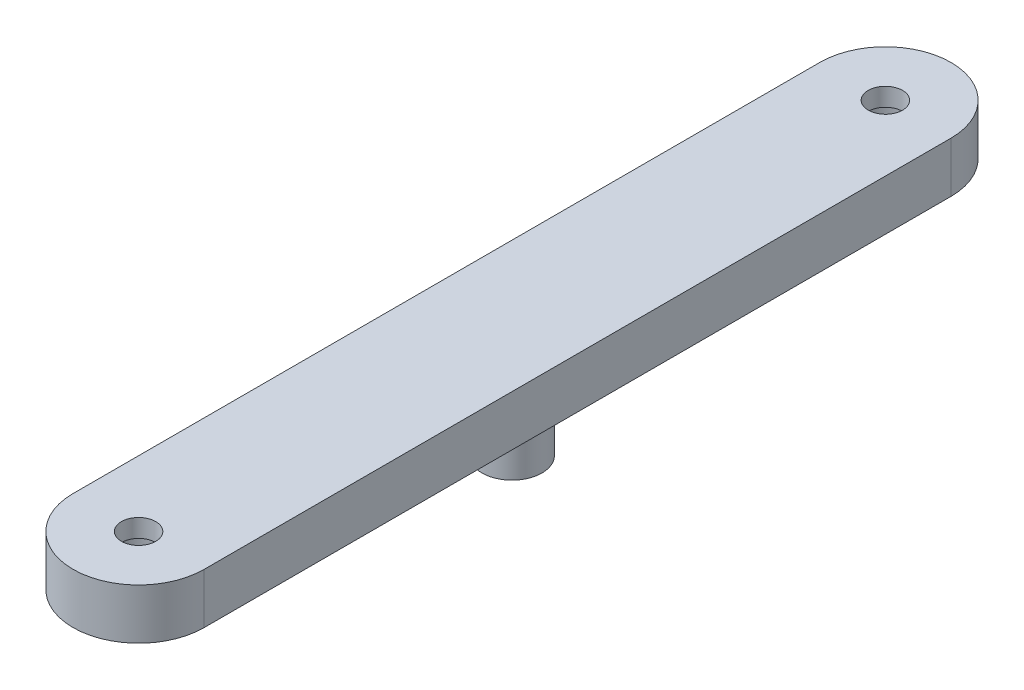
ISO-10303-21;
HEADER;
FILE_DESCRIPTION(('STEP AP214'),'2;1');
FILE_NAME('part.step','',(''),(''),'','','');
FILE_SCHEMA(('AUTOMOTIVE_DESIGN { 1 0 10303 214 1 1 1 1 }'));
ENDSEC;
DATA;
#1=APPLICATION_CONTEXT('core data for automotive mechanical design processes');
#2=APPLICATION_PROTOCOL_DEFINITION('international standard','automotive_design',2000,#1);
#3=PRODUCT_CONTEXT('',#1,'mechanical');
#4=PRODUCT('Part','Part','',(#3));
#5=PRODUCT_RELATED_PRODUCT_CATEGORY('part','',(#4));
#6=PRODUCT_DEFINITION_FORMATION('','',#4);
#7=PRODUCT_DEFINITION_CONTEXT('part definition',#1,'design');
#8=PRODUCT_DEFINITION('design','',#6,#7);
#9=PRODUCT_DEFINITION_SHAPE('','',#8);
#10=(LENGTH_UNIT() NAMED_UNIT(*) SI_UNIT(.MILLI.,.METRE.));
#11=(NAMED_UNIT(*) PLANE_ANGLE_UNIT() SI_UNIT($,.RADIAN.));
#12=(NAMED_UNIT(*) SI_UNIT($,.STERADIAN.) SOLID_ANGLE_UNIT());
#13=UNCERTAINTY_MEASURE_WITH_UNIT(LENGTH_MEASURE(1.E-05),#10,'distance_accuracy_value','');
#14=(GEOMETRIC_REPRESENTATION_CONTEXT(3) GLOBAL_UNCERTAINTY_ASSIGNED_CONTEXT((#13)) GLOBAL_UNIT_ASSIGNED_CONTEXT((#10,
#11,#12)) REPRESENTATION_CONTEXT('',''));
#15=CARTESIAN_POINT('',(0.,0.,0.));
#16=DIRECTION('',(0.,0.,1.));
#17=DIRECTION('',(1.,0.,0.));
#18=AXIS2_PLACEMENT_3D('',#15,#16,#17);
#19=CARTESIAN_POINT('',(6.5,-39.75,207.));
#20=DIRECTION('',(-1.,0.,0.));
#21=DIRECTION('',(0.,0.,1.));
#22=AXIS2_PLACEMENT_3D('',#19,#20,#21);
#23=PLANE('',#22);
#24=DIRECTION('',(0.,0.,-1.));
#25=VECTOR('',#24,1.);
#26=CARTESIAN_POINT('',(6.5,-44.75,207.));
#27=LINE('',#26,#25);
#28=CARTESIAN_POINT('',(6.5,-44.75,207.));
#29=VERTEX_POINT('',#28);
#30=CARTESIAN_POINT('',(6.5,-44.75,133.));
#31=VERTEX_POINT('',#30);
#32=EDGE_CURVE('E92',#29,#31,#27,.T.);
#33=ORIENTED_EDGE('',*,*,#32,.T.);
#34=DIRECTION('',(0.,-1.,0.));
#35=VECTOR('',#34,1.);
#36=CARTESIAN_POINT('',(6.5,-39.75,133.));
#37=LINE('',#36,#35);
#38=CARTESIAN_POINT('',(6.5,-39.75,133.));
#39=VERTEX_POINT('',#38);
#40=EDGE_CURVE('E11',#39,#31,#37,.T.);
#41=ORIENTED_EDGE('',*,*,#40,.F.);
#42=DIRECTION('',(0.,0.,-1.));
#43=VECTOR('',#42,1.);
#44=CARTESIAN_POINT('',(6.5,-39.75,207.));
#45=LINE('',#44,#43);
#46=CARTESIAN_POINT('',(6.5,-39.75,207.));
#47=VERTEX_POINT('',#46);
#48=EDGE_CURVE('E62',#47,#39,#45,.T.);
#49=ORIENTED_EDGE('',*,*,#48,.F.);
#50=DIRECTION('',(0.,-1.,0.));
#51=VECTOR('',#50,1.);
#52=CARTESIAN_POINT('',(6.5,-39.75,207.));
#53=LINE('',#52,#51);
#54=EDGE_CURVE('E102',#47,#29,#53,.T.);
#55=ORIENTED_EDGE('',*,*,#54,.T.);
#56=EDGE_LOOP('',(#33,#41,#49,#55));
#57=FACE_BOUND('',#56,.T.);
#58=ADVANCED_FACE('F43',(#57),#23,.F.);
#59=CARTESIAN_POINT('',(-6.5,-39.75,207.));
#60=DIRECTION('',(1.,0.,0.));
#61=DIRECTION('',(0.,0.,-1.));
#62=AXIS2_PLACEMENT_3D('',#59,#60,#61);
#63=PLANE('',#62);
#64=DIRECTION('',(0.,0.,1.));
#65=VECTOR('',#64,1.);
#66=CARTESIAN_POINT('',(-6.5,-44.75,207.));
#67=LINE('',#66,#65);
#68=CARTESIAN_POINT('',(-6.5,-44.75,133.));
#69=VERTEX_POINT('',#68);
#70=CARTESIAN_POINT('',(-6.5,-44.75,207.));
#71=VERTEX_POINT('',#70);
#72=EDGE_CURVE('E88',#69,#71,#67,.T.);
#73=ORIENTED_EDGE('',*,*,#72,.T.);
#74=DIRECTION('',(0.,-1.,0.));
#75=VECTOR('',#74,1.);
#76=CARTESIAN_POINT('',(-6.5,-39.75,207.));
#77=LINE('',#76,#75);
#78=CARTESIAN_POINT('',(-6.5,-39.75,207.));
#79=VERTEX_POINT('',#78);
#80=EDGE_CURVE('E89',#79,#71,#77,.T.);
#81=ORIENTED_EDGE('',*,*,#80,.F.);
#82=DIRECTION('',(0.,0.,1.));
#83=VECTOR('',#82,1.);
#84=CARTESIAN_POINT('',(-6.5,-39.75,207.));
#85=LINE('',#84,#83);
#86=CARTESIAN_POINT('',(-6.5,-39.75,133.));
#87=VERTEX_POINT('',#86);
#88=EDGE_CURVE('E124',#87,#79,#85,.T.);
#89=ORIENTED_EDGE('',*,*,#88,.F.);
#90=DIRECTION('',(0.,-1.,0.));
#91=VECTOR('',#90,1.);
#92=CARTESIAN_POINT('',(-6.5,-39.75,133.));
#93=LINE('',#92,#91);
#94=EDGE_CURVE('E52',#87,#69,#93,.T.);
#95=ORIENTED_EDGE('',*,*,#94,.T.);
#96=EDGE_LOOP('',(#73,#81,#89,#95));
#97=FACE_BOUND('',#96,.T.);
#98=ADVANCED_FACE('F86',(#97),#63,.F.);
#99=CARTESIAN_POINT('',(0.,-39.75,0.));
#100=DIRECTION('',(0.,-1.,0.));
#101=DIRECTION('',(0.,0.,-1.));
#102=AXIS2_PLACEMENT_3D('',#99,#100,#101);
#103=PLANE('',#102);
#104=CARTESIAN_POINT('',(0.,-39.75,133.));
#105=DIRECTION('',(0.,1.,0.));
#106=DIRECTION('',(0.,0.,1.));
#107=AXIS2_PLACEMENT_3D('',#104,#105,#106);
#108=CIRCLE('',#107,1.7);
#109=CARTESIAN_POINT('',(0.,-39.75,134.7));
#110=VERTEX_POINT('',#109);
#111=EDGE_CURVE('E158',#110,#110,#108,.T.);
#112=ORIENTED_EDGE('',*,*,#111,.F.);
#113=EDGE_LOOP('',(#112));
#114=FACE_BOUND('',#113,.T.);
#115=CARTESIAN_POINT('',(0.,-39.75,207.));
#116=DIRECTION('',(0.,1.,0.));
#117=DIRECTION('',(0.,0.,1.));
#118=AXIS2_PLACEMENT_3D('',#115,#116,#117);
#119=CIRCLE('',#118,1.7);
#120=CARTESIAN_POINT('',(0.,-39.75,208.7));
#121=VERTEX_POINT('',#120);
#122=EDGE_CURVE('E140',#121,#121,#119,.T.);
#123=ORIENTED_EDGE('',*,*,#122,.F.);
#124=EDGE_LOOP('',(#123));
#125=FACE_BOUND('',#124,.T.);
#126=ORIENTED_EDGE('',*,*,#48,.T.);
#127=CARTESIAN_POINT('',(0.,-39.75,133.));
#128=DIRECTION('',(0.,1.,0.));
#129=DIRECTION('',(0.,0.,1.));
#130=AXIS2_PLACEMENT_3D('',#127,#128,#129);
#131=CIRCLE('',#130,6.5);
#132=EDGE_CURVE('E114',#39,#87,#131,.T.);
#133=ORIENTED_EDGE('',*,*,#132,.T.);
#134=ORIENTED_EDGE('',*,*,#88,.T.);
#135=CARTESIAN_POINT('',(0.,-39.75,207.));
#136=DIRECTION('',(0.,1.,0.));
#137=DIRECTION('',(0.,0.,1.));
#138=AXIS2_PLACEMENT_3D('',#135,#136,#137);
#139=CIRCLE('',#138,6.5);
#140=EDGE_CURVE('E105',#79,#47,#139,.T.);
#141=ORIENTED_EDGE('',*,*,#140,.T.);
#142=EDGE_LOOP('',(#126,#133,#134,#141));
#143=FACE_BOUND('',#142,.T.);
#144=ADVANCED_FACE('F172',(#114,#125,#143),#103,.F.);
#145=CARTESIAN_POINT('',(0.,-44.75,0.));
#146=DIRECTION('',(0.,-1.,0.));
#147=DIRECTION('',(0.,0.,-1.));
#148=AXIS2_PLACEMENT_3D('',#145,#146,#147);
#149=PLANE('',#148);
#150=CARTESIAN_POINT('',(0.,-44.75,133.));
#151=DIRECTION('',(0.,1.,0.));
#152=DIRECTION('',(0.,0.,1.));
#153=AXIS2_PLACEMENT_3D('',#150,#151,#152);
#154=CIRCLE('',#153,3.);
#155=CARTESIAN_POINT('',(0.,-44.75,136.));
#156=VERTEX_POINT('',#155);
#157=EDGE_CURVE('E143',#156,#156,#154,.T.);
#158=ORIENTED_EDGE('',*,*,#157,.T.);
#159=EDGE_LOOP('',(#158));
#160=FACE_BOUND('',#159,.T.);
#161=CARTESIAN_POINT('',(0.,-44.75,207.));
#162=DIRECTION('',(0.,1.,0.));
#163=DIRECTION('',(0.,0.,1.));
#164=AXIS2_PLACEMENT_3D('',#161,#162,#163);
#165=CIRCLE('',#164,3.);
#166=CARTESIAN_POINT('',(0.,-44.75,210.));
#167=VERTEX_POINT('',#166);
#168=EDGE_CURVE('E146',#167,#167,#165,.T.);
#169=ORIENTED_EDGE('',*,*,#168,.T.);
#170=EDGE_LOOP('',(#169));
#171=FACE_BOUND('',#170,.T.);
#172=CARTESIAN_POINT('',(0.,-44.75,170.));
#173=DIRECTION('',(0.,1.,0.));
#174=DIRECTION('',(0.,0.,1.));
#175=AXIS2_PLACEMENT_3D('',#172,#173,#174);
#176=CIRCLE('',#175,2.975);
#177=CARTESIAN_POINT('',(0.,-44.75,172.975));
#178=VERTEX_POINT('',#177);
#179=EDGE_CURVE('E116',#178,#178,#176,.T.);
#180=ORIENTED_EDGE('',*,*,#179,.T.);
#181=EDGE_LOOP('',(#180));
#182=FACE_BOUND('',#181,.T.);
#183=ORIENTED_EDGE('',*,*,#72,.F.);
#184=CARTESIAN_POINT('',(0.,-44.75,133.));
#185=DIRECTION('',(0.,1.,0.));
#186=DIRECTION('',(0.,0.,1.));
#187=AXIS2_PLACEMENT_3D('',#184,#185,#186);
#188=CIRCLE('',#187,6.5);
#189=EDGE_CURVE('E71',#31,#69,#188,.T.);
#190=ORIENTED_EDGE('',*,*,#189,.F.);
#191=ORIENTED_EDGE('',*,*,#32,.F.);
#192=CARTESIAN_POINT('',(0.,-44.75,207.));
#193=DIRECTION('',(0.,1.,0.));
#194=DIRECTION('',(0.,0.,1.));
#195=AXIS2_PLACEMENT_3D('',#192,#193,#194);
#196=CIRCLE('',#195,6.5);
#197=EDGE_CURVE('E99',#71,#29,#196,.T.);
#198=ORIENTED_EDGE('',*,*,#197,.F.);
#199=EDGE_LOOP('',(#183,#190,#191,#198));
#200=FACE_BOUND('',#199,.T.);
#201=ADVANCED_FACE('F110',(#160,#171,#182,#200),#149,.T.);
#202=CARTESIAN_POINT('',(0.,-39.75,207.));
#203=DIRECTION('',(0.,-1.,0.));
#204=DIRECTION('',(0.,0.,-1.));
#205=AXIS2_PLACEMENT_3D('',#202,#203,#204);
#206=CYLINDRICAL_SURFACE('',#205,6.5);
#207=ORIENTED_EDGE('',*,*,#197,.T.);
#208=ORIENTED_EDGE('',*,*,#54,.F.);
#209=ORIENTED_EDGE('',*,*,#140,.F.);
#210=ORIENTED_EDGE('',*,*,#80,.T.);
#211=EDGE_LOOP('',(#207,#208,#209,#210));
#212=FACE_BOUND('',#211,.T.);
#213=ADVANCED_FACE('F97',(#212),#206,.T.);
#214=CARTESIAN_POINT('',(0.,-39.75,133.));
#215=DIRECTION('',(0.,-1.,0.));
#216=DIRECTION('',(0.,0.,-1.));
#217=AXIS2_PLACEMENT_3D('',#214,#215,#216);
#218=CYLINDRICAL_SURFACE('',#217,6.5);
#219=ORIENTED_EDGE('',*,*,#132,.F.);
#220=ORIENTED_EDGE('',*,*,#40,.T.);
#221=ORIENTED_EDGE('',*,*,#189,.T.);
#222=ORIENTED_EDGE('',*,*,#94,.F.);
#223=EDGE_LOOP('',(#219,#220,#221,#222));
#224=FACE_BOUND('',#223,.T.);
#225=ADVANCED_FACE('F174',(#224),#218,.T.);
#226=CARTESIAN_POINT('',(0.,-44.75,170.));
#227=DIRECTION('',(0.,-1.,0.));
#228=DIRECTION('',(0.,0.,-1.));
#229=AXIS2_PLACEMENT_3D('',#226,#227,#228);
#230=CYLINDRICAL_SURFACE('',#229,2.975);
#231=ORIENTED_EDGE('',*,*,#179,.F.);
#232=EDGE_LOOP('',(#231));
#233=FACE_BOUND('',#232,.T.);
#234=CARTESIAN_POINT('',(0.,-51.75,170.));
#235=DIRECTION('',(0.,1.,0.));
#236=DIRECTION('',(0.,0.,1.));
#237=AXIS2_PLACEMENT_3D('',#234,#235,#236);
#238=CIRCLE('',#237,2.975);
#239=CARTESIAN_POINT('',(0.,-51.75,172.975));
#240=VERTEX_POINT('',#239);
#241=EDGE_CURVE('E161',#240,#240,#238,.T.);
#242=ORIENTED_EDGE('',*,*,#241,.T.);
#243=EDGE_LOOP('',(#242));
#244=FACE_BOUND('',#243,.T.);
#245=ADVANCED_FACE('F175',(#233,#244),#230,.T.);
#246=CARTESIAN_POINT('',(0.,-51.75,170.));
#247=DIRECTION('',(0.,1.,0.));
#248=DIRECTION('',(0.,0.,1.));
#249=AXIS2_PLACEMENT_3D('',#246,#247,#248);
#250=PLANE('',#249);
#251=ORIENTED_EDGE('',*,*,#241,.F.);
#252=EDGE_LOOP('',(#251));
#253=FACE_BOUND('',#252,.T.);
#254=ADVANCED_FACE('F176',(#253),#250,.F.);
#255=CARTESIAN_POINT('',(0.,-39.75,207.));
#256=DIRECTION('',(0.,-1.,0.));
#257=DIRECTION('',(0.,0.,-1.));
#258=AXIS2_PLACEMENT_3D('',#255,#256,#257);
#259=CYLINDRICAL_SURFACE('',#258,1.7);
#260=CARTESIAN_POINT('',(0.,-41.55,207.));
#261=DIRECTION('',(0.,1.,0.));
#262=DIRECTION('',(0.,0.,1.));
#263=AXIS2_PLACEMENT_3D('',#260,#261,#262);
#264=CIRCLE('',#263,1.7);
#265=CARTESIAN_POINT('',(0.,-41.55,208.7));
#266=VERTEX_POINT('',#265);
#267=EDGE_CURVE('E46',#266,#266,#264,.T.);
#268=ORIENTED_EDGE('',*,*,#267,.F.);
#269=EDGE_LOOP('',(#268));
#270=FACE_BOUND('',#269,.T.);
#271=ORIENTED_EDGE('',*,*,#122,.T.);
#272=EDGE_LOOP('',(#271));
#273=FACE_BOUND('',#272,.T.);
#274=ADVANCED_FACE('F204',(#270,#273),#259,.F.);
#275=CARTESIAN_POINT('',(0.,-39.75,133.));
#276=DIRECTION('',(0.,-1.,0.));
#277=DIRECTION('',(0.,0.,-1.));
#278=AXIS2_PLACEMENT_3D('',#275,#276,#277);
#279=CYLINDRICAL_SURFACE('',#278,1.7);
#280=CARTESIAN_POINT('',(0.,-41.55,133.));
#281=DIRECTION('',(0.,1.,0.));
#282=DIRECTION('',(0.,0.,1.));
#283=AXIS2_PLACEMENT_3D('',#280,#281,#282);
#284=CIRCLE('',#283,1.7);
#285=CARTESIAN_POINT('',(0.,-41.55,134.7));
#286=VERTEX_POINT('',#285);
#287=EDGE_CURVE('E128',#286,#286,#284,.T.);
#288=ORIENTED_EDGE('',*,*,#287,.F.);
#289=EDGE_LOOP('',(#288));
#290=FACE_BOUND('',#289,.T.);
#291=ORIENTED_EDGE('',*,*,#111,.T.);
#292=EDGE_LOOP('',(#291));
#293=FACE_BOUND('',#292,.T.);
#294=ADVANCED_FACE('F208',(#290,#293),#279,.F.);
#295=CARTESIAN_POINT('',(0.,-41.55,133.));
#296=DIRECTION('',(0.,-1.,0.));
#297=DIRECTION('',(0.,0.,-1.));
#298=AXIS2_PLACEMENT_3D('',#295,#296,#297);
#299=CYLINDRICAL_SURFACE('',#298,3.);
#300=CARTESIAN_POINT('',(0.,-41.55,133.));
#301=DIRECTION('',(0.,1.,0.));
#302=DIRECTION('',(0.,0.,1.));
#303=AXIS2_PLACEMENT_3D('',#300,#301,#302);
#304=CIRCLE('',#303,3.);
#305=CARTESIAN_POINT('',(0.,-41.55,136.));
#306=VERTEX_POINT('',#305);
#307=EDGE_CURVE('E134',#306,#306,#304,.T.);
#308=ORIENTED_EDGE('',*,*,#307,.T.);
#309=EDGE_LOOP('',(#308));
#310=FACE_BOUND('',#309,.T.);
#311=ORIENTED_EDGE('',*,*,#157,.F.);
#312=EDGE_LOOP('',(#311));
#313=FACE_BOUND('',#312,.T.);
#314=ADVANCED_FACE('F212',(#310,#313),#299,.F.);
#315=CARTESIAN_POINT('',(0.,-41.55,133.));
#316=DIRECTION('',(0.,1.,0.));
#317=DIRECTION('',(0.,0.,1.));
#318=AXIS2_PLACEMENT_3D('',#315,#316,#317);
#319=PLANE('',#318);
#320=ORIENTED_EDGE('',*,*,#287,.T.);
#321=EDGE_LOOP('',(#320));
#322=FACE_BOUND('',#321,.T.);
#323=ORIENTED_EDGE('',*,*,#307,.F.);
#324=EDGE_LOOP('',(#323));
#325=FACE_BOUND('',#324,.T.);
#326=ADVANCED_FACE('F224',(#322,#325),#319,.F.);
#327=CARTESIAN_POINT('',(0.,-41.55,207.));
#328=DIRECTION('',(0.,-1.,0.));
#329=DIRECTION('',(0.,0.,-1.));
#330=AXIS2_PLACEMENT_3D('',#327,#328,#329);
#331=CYLINDRICAL_SURFACE('',#330,3.);
#332=CARTESIAN_POINT('',(0.,-41.55,207.));
#333=DIRECTION('',(0.,1.,0.));
#334=DIRECTION('',(0.,0.,1.));
#335=AXIS2_PLACEMENT_3D('',#332,#333,#334);
#336=CIRCLE('',#335,3.);
#337=CARTESIAN_POINT('',(0.,-41.55,210.));
#338=VERTEX_POINT('',#337);
#339=EDGE_CURVE('E152',#338,#338,#336,.T.);
#340=ORIENTED_EDGE('',*,*,#339,.T.);
#341=EDGE_LOOP('',(#340));
#342=FACE_BOUND('',#341,.T.);
#343=ORIENTED_EDGE('',*,*,#168,.F.);
#344=EDGE_LOOP('',(#343));
#345=FACE_BOUND('',#344,.T.);
#346=ADVANCED_FACE('F218',(#342,#345),#331,.F.);
#347=CARTESIAN_POINT('',(0.,-41.55,207.));
#348=DIRECTION('',(0.,1.,0.));
#349=DIRECTION('',(0.,0.,1.));
#350=AXIS2_PLACEMENT_3D('',#347,#348,#349);
#351=PLANE('',#350);
#352=ORIENTED_EDGE('',*,*,#267,.T.);
#353=EDGE_LOOP('',(#352));
#354=FACE_BOUND('',#353,.T.);
#355=ORIENTED_EDGE('',*,*,#339,.F.);
#356=EDGE_LOOP('',(#355));
#357=FACE_BOUND('',#356,.T.);
#358=ADVANCED_FACE('F216',(#354,#357),#351,.F.);
#359=CLOSED_SHELL('',(#58,#98,#144,#201,#213,#225,#245,#254,#274,#294,#314,#326,#346,#358));
#360=MANIFOLD_SOLID_BREP('B2',#359);
#361=ADVANCED_BREP_SHAPE_REPRESENTATION('',(#18,#360),#14);
#362=SHAPE_DEFINITION_REPRESENTATION(#9,#361);
ENDSEC;
END-ISO-10303-21;
